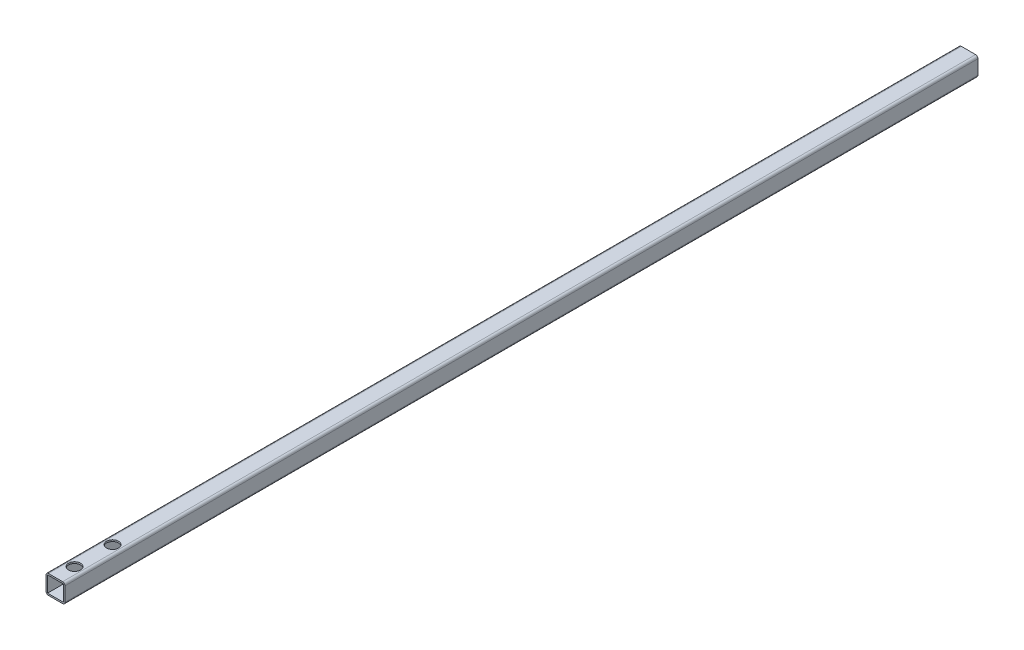
ISO-10303-21;
HEADER;
FILE_DESCRIPTION(('STEP AP214'),'2;1');
FILE_NAME('part.step','',(''),(''),'','','');
FILE_SCHEMA(('AUTOMOTIVE_DESIGN { 1 0 10303 214 1 1 1 1 }'));
ENDSEC;
DATA;
#1=APPLICATION_CONTEXT('core data for automotive mechanical design processes');
#2=APPLICATION_PROTOCOL_DEFINITION('international standard','automotive_design',2000,#1);
#3=PRODUCT_CONTEXT('',#1,'mechanical');
#4=PRODUCT('Part','Part','',(#3));
#5=PRODUCT_RELATED_PRODUCT_CATEGORY('part','',(#4));
#6=PRODUCT_DEFINITION_FORMATION('','',#4);
#7=PRODUCT_DEFINITION_CONTEXT('part definition',#1,'design');
#8=PRODUCT_DEFINITION('design','',#6,#7);
#9=PRODUCT_DEFINITION_SHAPE('','',#8);
#10=(LENGTH_UNIT() NAMED_UNIT(*) SI_UNIT(.MILLI.,.METRE.));
#11=(NAMED_UNIT(*) PLANE_ANGLE_UNIT() SI_UNIT($,.RADIAN.));
#12=(NAMED_UNIT(*) SI_UNIT($,.STERADIAN.) SOLID_ANGLE_UNIT());
#13=UNCERTAINTY_MEASURE_WITH_UNIT(LENGTH_MEASURE(1.E-05),#10,'distance_accuracy_value','');
#14=(GEOMETRIC_REPRESENTATION_CONTEXT(3) GLOBAL_UNCERTAINTY_ASSIGNED_CONTEXT((#13)) GLOBAL_UNIT_ASSIGNED_CONTEXT((#10,
#11,#12)) REPRESENTATION_CONTEXT('',''));
#15=CARTESIAN_POINT('',(0.,0.,0.));
#16=DIRECTION('',(0.,0.,1.));
#17=DIRECTION('',(1.,0.,0.));
#18=AXIS2_PLACEMENT_3D('',#15,#16,#17);
#19=CARTESIAN_POINT('',(-9.525,-9.525,1219.2));
#20=DIRECTION('',(0.,0.,-1.));
#21=DIRECTION('',(-1.,0.,0.));
#22=AXIS2_PLACEMENT_3D('',#19,#20,#21);
#23=PLANE('',#22);
#24=CARTESIAN_POINT('',(-9.525,-9.525,1219.2));
#25=DIRECTION('',(0.,0.,1.));
#26=DIRECTION('',(-1.,0.,0.));
#27=AXIS2_PLACEMENT_3D('',#24,#25,#26);
#28=CIRCLE('',#27,3.175);
#29=CARTESIAN_POINT('',(-12.7,-9.52499999999997,1219.2));
#30=VERTEX_POINT('',#29);
#31=CARTESIAN_POINT('',(-9.52499999999997,-12.7,1219.2));
#32=VERTEX_POINT('',#31);
#33=EDGE_CURVE('E187',#30,#32,#28,.T.);
#34=ORIENTED_EDGE('',*,*,#33,.T.);
#35=DIRECTION('',(1.,0.,0.));
#36=VECTOR('',#35,1.);
#37=CARTESIAN_POINT('',(-9.52499999999997,-12.7,1219.2));
#38=LINE('',#37,#36);
#39=CARTESIAN_POINT('',(9.52499999999998,-12.7,1219.2));
#40=VERTEX_POINT('',#39);
#41=EDGE_CURVE('E191',#32,#40,#38,.T.);
#42=ORIENTED_EDGE('',*,*,#41,.T.);
#43=CARTESIAN_POINT('',(9.525,-9.525,1219.2));
#44=DIRECTION('',(0.,0.,1.));
#45=DIRECTION('',(1.,0.,0.));
#46=AXIS2_PLACEMENT_3D('',#43,#44,#45);
#47=CIRCLE('',#46,3.175);
#48=CARTESIAN_POINT('',(12.7,-9.525,1219.2));
#49=VERTEX_POINT('',#48);
#50=EDGE_CURVE('E195',#40,#49,#47,.T.);
#51=ORIENTED_EDGE('',*,*,#50,.T.);
#52=DIRECTION('',(0.,1.,0.));
#53=VECTOR('',#52,1.);
#54=CARTESIAN_POINT('',(12.7,-9.52499999999997,1219.2));
#55=LINE('',#54,#53);
#56=CARTESIAN_POINT('',(12.7,9.52499999999998,1219.2));
#57=VERTEX_POINT('',#56);
#58=EDGE_CURVE('E198',#49,#57,#55,.T.);
#59=ORIENTED_EDGE('',*,*,#58,.T.);
#60=CARTESIAN_POINT('',(9.525,9.52500000000001,1219.2));
#61=DIRECTION('',(0.,0.,1.));
#62=DIRECTION('',(-1.,0.,0.));
#63=AXIS2_PLACEMENT_3D('',#60,#61,#62);
#64=CIRCLE('',#63,3.175);
#65=CARTESIAN_POINT('',(9.52499999999998,12.7,1219.2));
#66=VERTEX_POINT('',#65);
#67=EDGE_CURVE('E201',#57,#66,#64,.T.);
#68=ORIENTED_EDGE('',*,*,#67,.T.);
#69=DIRECTION('',(-1.,0.,0.));
#70=VECTOR('',#69,1.);
#71=CARTESIAN_POINT('',(-9.52499999999997,12.7,1219.2));
#72=LINE('',#71,#70);
#73=CARTESIAN_POINT('',(-9.52499999999997,12.7,1219.2));
#74=VERTEX_POINT('',#73);
#75=EDGE_CURVE('E204',#66,#74,#72,.T.);
#76=ORIENTED_EDGE('',*,*,#75,.T.);
#77=CARTESIAN_POINT('',(-9.525,9.52500000000001,1219.2));
#78=DIRECTION('',(0.,0.,1.));
#79=DIRECTION('',(-1.,0.,0.));
#80=AXIS2_PLACEMENT_3D('',#77,#78,#79);
#81=CIRCLE('',#80,3.175);
#82=CARTESIAN_POINT('',(-12.7,9.52499999999998,1219.2));
#83=VERTEX_POINT('',#82);
#84=EDGE_CURVE('E207',#74,#83,#81,.T.);
#85=ORIENTED_EDGE('',*,*,#84,.T.);
#86=DIRECTION('',(0.,-1.,0.));
#87=VECTOR('',#86,1.);
#88=CARTESIAN_POINT('',(-12.7,-9.52499999999997,1219.2));
#89=LINE('',#88,#87);
#90=EDGE_CURVE('E210',#83,#30,#89,.T.);
#91=ORIENTED_EDGE('',*,*,#90,.T.);
#92=EDGE_LOOP('',(#34,#42,#51,#59,#68,#76,#85,#91));
#93=FACE_BOUND('',#92,.T.);
#94=DIRECTION('',(0.,1.,0.));
#95=VECTOR('',#94,1.);
#96=CARTESIAN_POINT('',(10.5918,-10.5918,1219.2));
#97=LINE('',#96,#95);
#98=CARTESIAN_POINT('',(10.5918,-10.5918,1219.2));
#99=VERTEX_POINT('',#98);
#100=CARTESIAN_POINT('',(10.5918,10.5918,1219.2));
#101=VERTEX_POINT('',#100);
#102=EDGE_CURVE('E137',#99,#101,#97,.T.);
#103=ORIENTED_EDGE('',*,*,#102,.F.);
#104=DIRECTION('',(1.,0.,0.));
#105=VECTOR('',#104,1.);
#106=CARTESIAN_POINT('',(-10.5918,-10.5918,1219.2));
#107=LINE('',#106,#105);
#108=CARTESIAN_POINT('',(-10.5918,-10.5918,1219.2));
#109=VERTEX_POINT('',#108);
#110=EDGE_CURVE('E163',#109,#99,#107,.T.);
#111=ORIENTED_EDGE('',*,*,#110,.F.);
#112=DIRECTION('',(0.,-1.,0.));
#113=VECTOR('',#112,1.);
#114=CARTESIAN_POINT('',(-10.5918,-10.5918,1219.2));
#115=LINE('',#114,#113);
#116=CARTESIAN_POINT('',(-10.5918,10.5918,1219.2));
#117=VERTEX_POINT('',#116);
#118=EDGE_CURVE('E159',#117,#109,#115,.T.);
#119=ORIENTED_EDGE('',*,*,#118,.F.);
#120=DIRECTION('',(-1.,0.,0.));
#121=VECTOR('',#120,1.);
#122=CARTESIAN_POINT('',(-10.5918,10.5918,1219.2));
#123=LINE('',#122,#121);
#124=EDGE_CURVE('E146',#101,#117,#123,.T.);
#125=ORIENTED_EDGE('',*,*,#124,.F.);
#126=EDGE_LOOP('',(#103,#111,#119,#125));
#127=FACE_BOUND('',#126,.T.);
#128=ADVANCED_FACE('F45',(#93,#127),#23,.F.);
#129=CARTESIAN_POINT('',(-9.525,-9.525,0.));
#130=DIRECTION('',(0.,0.,-1.));
#131=DIRECTION('',(-1.,0.,0.));
#132=AXIS2_PLACEMENT_3D('',#129,#130,#131);
#133=PLANE('',#132);
#134=CARTESIAN_POINT('',(-9.525,-9.525,0.));
#135=DIRECTION('',(0.,0.,1.));
#136=DIRECTION('',(-1.,0.,0.));
#137=AXIS2_PLACEMENT_3D('',#134,#135,#136);
#138=CIRCLE('',#137,3.175);
#139=CARTESIAN_POINT('',(-12.7,-9.52499999999997,0.));
#140=VERTEX_POINT('',#139);
#141=CARTESIAN_POINT('',(-9.52499999999997,-12.7,0.));
#142=VERTEX_POINT('',#141);
#143=EDGE_CURVE('E155',#140,#142,#138,.T.);
#144=ORIENTED_EDGE('',*,*,#143,.F.);
#145=DIRECTION('',(0.,-1.,0.));
#146=VECTOR('',#145,1.);
#147=CARTESIAN_POINT('',(-12.7,-9.52499999999997,0.));
#148=LINE('',#147,#146);
#149=CARTESIAN_POINT('',(-12.7,9.52499999999998,0.));
#150=VERTEX_POINT('',#149);
#151=EDGE_CURVE('E192',#150,#140,#148,.T.);
#152=ORIENTED_EDGE('',*,*,#151,.F.);
#153=CARTESIAN_POINT('',(-9.525,9.52500000000001,0.));
#154=DIRECTION('',(0.,0.,1.));
#155=DIRECTION('',(-1.,0.,0.));
#156=AXIS2_PLACEMENT_3D('',#153,#154,#155);
#157=CIRCLE('',#156,3.175);
#158=CARTESIAN_POINT('',(-9.52499999999997,12.7,0.));
#159=VERTEX_POINT('',#158);
#160=EDGE_CURVE('E232',#159,#150,#157,.T.);
#161=ORIENTED_EDGE('',*,*,#160,.F.);
#162=DIRECTION('',(-1.,0.,0.));
#163=VECTOR('',#162,1.);
#164=CARTESIAN_POINT('',(-9.52499999999997,12.7,0.));
#165=LINE('',#164,#163);
#166=CARTESIAN_POINT('',(9.52499999999998,12.7,0.));
#167=VERTEX_POINT('',#166);
#168=EDGE_CURVE('E229',#167,#159,#165,.T.);
#169=ORIENTED_EDGE('',*,*,#168,.F.);
#170=CARTESIAN_POINT('',(9.525,9.52500000000001,0.));
#171=DIRECTION('',(0.,0.,1.));
#172=DIRECTION('',(-1.,0.,0.));
#173=AXIS2_PLACEMENT_3D('',#170,#171,#172);
#174=CIRCLE('',#173,3.175);
#175=CARTESIAN_POINT('',(12.7,9.52499999999998,0.));
#176=VERTEX_POINT('',#175);
#177=EDGE_CURVE('E226',#176,#167,#174,.T.);
#178=ORIENTED_EDGE('',*,*,#177,.F.);
#179=DIRECTION('',(0.,1.,0.));
#180=VECTOR('',#179,1.);
#181=CARTESIAN_POINT('',(12.7,-9.52499999999997,0.));
#182=LINE('',#181,#180);
#183=CARTESIAN_POINT('',(12.7,-9.525,0.));
#184=VERTEX_POINT('',#183);
#185=EDGE_CURVE('E223',#184,#176,#182,.T.);
#186=ORIENTED_EDGE('',*,*,#185,.F.);
#187=CARTESIAN_POINT('',(9.525,-9.525,0.));
#188=DIRECTION('',(0.,0.,1.));
#189=DIRECTION('',(1.,0.,0.));
#190=AXIS2_PLACEMENT_3D('',#187,#188,#189);
#191=CIRCLE('',#190,3.175);
#192=CARTESIAN_POINT('',(9.52499999999998,-12.7,0.));
#193=VERTEX_POINT('',#192);
#194=EDGE_CURVE('E220',#193,#184,#191,.T.);
#195=ORIENTED_EDGE('',*,*,#194,.F.);
#196=DIRECTION('',(1.,0.,0.));
#197=VECTOR('',#196,1.);
#198=CARTESIAN_POINT('',(-9.52499999999997,-12.7,0.));
#199=LINE('',#198,#197);
#200=EDGE_CURVE('E217',#142,#193,#199,.T.);
#201=ORIENTED_EDGE('',*,*,#200,.F.);
#202=EDGE_LOOP('',(#144,#152,#161,#169,#178,#186,#195,#201));
#203=FACE_BOUND('',#202,.T.);
#204=DIRECTION('',(1.,0.,0.));
#205=VECTOR('',#204,1.);
#206=CARTESIAN_POINT('',(-10.5918,-10.5918,0.));
#207=LINE('',#206,#205);
#208=CARTESIAN_POINT('',(-10.5918,-10.5918,0.));
#209=VERTEX_POINT('',#208);
#210=CARTESIAN_POINT('',(10.5918,-10.5918,0.));
#211=VERTEX_POINT('',#210);
#212=EDGE_CURVE('E147',#209,#211,#207,.T.);
#213=ORIENTED_EDGE('',*,*,#212,.T.);
#214=DIRECTION('',(0.,1.,0.));
#215=VECTOR('',#214,1.);
#216=CARTESIAN_POINT('',(10.5918,-10.5918,0.));
#217=LINE('',#216,#215);
#218=CARTESIAN_POINT('',(10.5918,10.5918,0.));
#219=VERTEX_POINT('',#218);
#220=EDGE_CURVE('E71',#211,#219,#217,.T.);
#221=ORIENTED_EDGE('',*,*,#220,.T.);
#222=DIRECTION('',(-1.,0.,0.));
#223=VECTOR('',#222,1.);
#224=CARTESIAN_POINT('',(-10.5918,10.5918,0.));
#225=LINE('',#224,#223);
#226=CARTESIAN_POINT('',(-10.5918,10.5918,0.));
#227=VERTEX_POINT('',#226);
#228=EDGE_CURVE('E153',#219,#227,#225,.T.);
#229=ORIENTED_EDGE('',*,*,#228,.T.);
#230=DIRECTION('',(0.,-1.,0.));
#231=VECTOR('',#230,1.);
#232=CARTESIAN_POINT('',(-10.5918,-10.5918,0.));
#233=LINE('',#232,#231);
#234=EDGE_CURVE('E174',#227,#209,#233,.T.);
#235=ORIENTED_EDGE('',*,*,#234,.T.);
#236=EDGE_LOOP('',(#213,#221,#229,#235));
#237=FACE_BOUND('',#236,.T.);
#238=ADVANCED_FACE('F314',(#203,#237),#133,.T.);
#239=CARTESIAN_POINT('',(-9.525,-9.525,1219.2));
#240=DIRECTION('',(0.,0.,-1.));
#241=DIRECTION('',(-1.,0.,0.));
#242=AXIS2_PLACEMENT_3D('',#239,#240,#241);
#243=CYLINDRICAL_SURFACE('',#242,3.175);
#244=ORIENTED_EDGE('',*,*,#143,.T.);
#245=DIRECTION('',(0.,0.,-1.));
#246=VECTOR('',#245,1.);
#247=CARTESIAN_POINT('',(-9.52499999999997,-12.7,1219.2));
#248=LINE('',#247,#246);
#249=EDGE_CURVE('E11',#32,#142,#248,.T.);
#250=ORIENTED_EDGE('',*,*,#249,.F.);
#251=ORIENTED_EDGE('',*,*,#33,.F.);
#252=DIRECTION('',(0.,0.,-1.));
#253=VECTOR('',#252,1.);
#254=CARTESIAN_POINT('',(-12.7,-9.52499999999997,1219.2));
#255=LINE('',#254,#253);
#256=EDGE_CURVE('E213',#30,#140,#255,.T.);
#257=ORIENTED_EDGE('',*,*,#256,.T.);
#258=EDGE_LOOP('',(#244,#250,#251,#257));
#259=FACE_BOUND('',#258,.T.);
#260=ADVANCED_FACE('F47',(#259),#243,.T.);
#261=CARTESIAN_POINT('',(-9.52499999999997,-12.7,1219.2));
#262=DIRECTION('',(0.,1.,0.));
#263=DIRECTION('',(0.,0.,1.));
#264=AXIS2_PLACEMENT_3D('',#261,#262,#263);
#265=PLANE('',#264);
#266=CARTESIAN_POINT('',(0.,-12.7000000000002,1193.8));
#267=DIRECTION('',(0.,1.,0.));
#268=DIRECTION('',(0.,0.,1.));
#269=AXIS2_PLACEMENT_3D('',#266,#267,#268);
#270=CIRCLE('',#269,8.00099999999997);
#271=CARTESIAN_POINT('',(0.,-12.7000000000004,1201.801));
#272=VERTEX_POINT('',#271);
#273=EDGE_CURVE('E171',#272,#272,#270,.T.);
#274=ORIENTED_EDGE('',*,*,#273,.T.);
#275=EDGE_LOOP('',(#274));
#276=FACE_BOUND('',#275,.T.);
#277=CARTESIAN_POINT('',(-1.70787202191443E-13,-12.7000000000002,1143.));
#278=DIRECTION('',(0.,1.,0.));
#279=DIRECTION('',(0.,0.,1.));
#280=AXIS2_PLACEMENT_3D('',#277,#278,#279);
#281=CIRCLE('',#280,8.00099999999997);
#282=CARTESIAN_POINT('',(-1.70787202191443E-13,-12.7000000000004,1151.001));
#283=VERTEX_POINT('',#282);
#284=EDGE_CURVE('E272',#283,#283,#281,.T.);
#285=ORIENTED_EDGE('',*,*,#284,.T.);
#286=EDGE_LOOP('',(#285));
#287=FACE_BOUND('',#286,.T.);
#288=ORIENTED_EDGE('',*,*,#200,.T.);
#289=DIRECTION('',(0.,0.,-1.));
#290=VECTOR('',#289,1.);
#291=CARTESIAN_POINT('',(9.52499999999998,-12.7,1219.2));
#292=LINE('',#291,#290);
#293=EDGE_CURVE('E55',#40,#193,#292,.T.);
#294=ORIENTED_EDGE('',*,*,#293,.F.);
#295=ORIENTED_EDGE('',*,*,#41,.F.);
#296=ORIENTED_EDGE('',*,*,#249,.T.);
#297=EDGE_LOOP('',(#288,#294,#295,#296));
#298=FACE_BOUND('',#297,.T.);
#299=ADVANCED_FACE('F293',(#276,#287,#298),#265,.F.);
#300=CARTESIAN_POINT('',(9.525,-9.525,1219.2));
#301=DIRECTION('',(0.,0.,-1.));
#302=DIRECTION('',(-1.,0.,0.));
#303=AXIS2_PLACEMENT_3D('',#300,#301,#302);
#304=CYLINDRICAL_SURFACE('',#303,3.175);
#305=ORIENTED_EDGE('',*,*,#194,.T.);
#306=DIRECTION('',(0.,0.,-1.));
#307=VECTOR('',#306,1.);
#308=CARTESIAN_POINT('',(12.7,-9.525,1219.2));
#309=LINE('',#308,#307);
#310=EDGE_CURVE('E256',#49,#184,#309,.T.);
#311=ORIENTED_EDGE('',*,*,#310,.F.);
#312=ORIENTED_EDGE('',*,*,#50,.F.);
#313=ORIENTED_EDGE('',*,*,#293,.T.);
#314=EDGE_LOOP('',(#305,#311,#312,#313));
#315=FACE_BOUND('',#314,.T.);
#316=ADVANCED_FACE('F344',(#315),#304,.T.);
#317=CARTESIAN_POINT('',(12.7,-9.52499999999997,1219.2));
#318=DIRECTION('',(-1.,0.,0.));
#319=DIRECTION('',(0.,0.,1.));
#320=AXIS2_PLACEMENT_3D('',#317,#318,#319);
#321=PLANE('',#320);
#322=ORIENTED_EDGE('',*,*,#185,.T.);
#323=DIRECTION('',(0.,0.,-1.));
#324=VECTOR('',#323,1.);
#325=CARTESIAN_POINT('',(12.7,9.52499999999998,1219.2));
#326=LINE('',#325,#324);
#327=EDGE_CURVE('E252',#57,#176,#326,.T.);
#328=ORIENTED_EDGE('',*,*,#327,.F.);
#329=ORIENTED_EDGE('',*,*,#58,.F.);
#330=ORIENTED_EDGE('',*,*,#310,.T.);
#331=EDGE_LOOP('',(#322,#328,#329,#330));
#332=FACE_BOUND('',#331,.T.);
#333=ADVANCED_FACE('F340',(#332),#321,.F.);
#334=CARTESIAN_POINT('',(9.525,9.52500000000001,1219.2));
#335=DIRECTION('',(0.,0.,-1.));
#336=DIRECTION('',(-1.,0.,0.));
#337=AXIS2_PLACEMENT_3D('',#334,#335,#336);
#338=CYLINDRICAL_SURFACE('',#337,3.175);
#339=ORIENTED_EDGE('',*,*,#177,.T.);
#340=DIRECTION('',(0.,0.,-1.));
#341=VECTOR('',#340,1.);
#342=CARTESIAN_POINT('',(9.52499999999998,12.7,1219.2));
#343=LINE('',#342,#341);
#344=EDGE_CURVE('E248',#66,#167,#343,.T.);
#345=ORIENTED_EDGE('',*,*,#344,.F.);
#346=ORIENTED_EDGE('',*,*,#67,.F.);
#347=ORIENTED_EDGE('',*,*,#327,.T.);
#348=EDGE_LOOP('',(#339,#345,#346,#347));
#349=FACE_BOUND('',#348,.T.);
#350=ADVANCED_FACE('F336',(#349),#338,.T.);
#351=CARTESIAN_POINT('',(-9.52499999999997,12.7,1219.2));
#352=DIRECTION('',(0.,-1.,0.));
#353=DIRECTION('',(0.,0.,-1.));
#354=AXIS2_PLACEMENT_3D('',#351,#352,#353);
#355=PLANE('',#354);
#356=CARTESIAN_POINT('',(0.,12.7,1193.8));
#357=DIRECTION('',(0.,1.,0.));
#358=DIRECTION('',(0.,0.,1.));
#359=AXIS2_PLACEMENT_3D('',#356,#357,#358);
#360=CIRCLE('',#359,8.00099999999997);
#361=CARTESIAN_POINT('',(0.,12.6999999999999,1201.801));
#362=VERTEX_POINT('',#361);
#363=EDGE_CURVE('E266',#362,#362,#360,.T.);
#364=ORIENTED_EDGE('',*,*,#363,.F.);
#365=EDGE_LOOP('',(#364));
#366=FACE_BOUND('',#365,.T.);
#367=CARTESIAN_POINT('',(-1.70787202191443E-13,12.7,1143.));
#368=DIRECTION('',(0.,1.,0.));
#369=DIRECTION('',(0.,0.,1.));
#370=AXIS2_PLACEMENT_3D('',#367,#368,#369);
#371=CIRCLE('',#370,8.00099999999997);
#372=CARTESIAN_POINT('',(-1.70787202191443E-13,12.6999999999999,1151.001));
#373=VERTEX_POINT('',#372);
#374=EDGE_CURVE('E275',#373,#373,#371,.T.);
#375=ORIENTED_EDGE('',*,*,#374,.F.);
#376=EDGE_LOOP('',(#375));
#377=FACE_BOUND('',#376,.T.);
#378=ORIENTED_EDGE('',*,*,#168,.T.);
#379=DIRECTION('',(0.,0.,-1.));
#380=VECTOR('',#379,1.);
#381=CARTESIAN_POINT('',(-9.52499999999997,12.7,1219.2));
#382=LINE('',#381,#380);
#383=EDGE_CURVE('E244',#74,#159,#382,.T.);
#384=ORIENTED_EDGE('',*,*,#383,.F.);
#385=ORIENTED_EDGE('',*,*,#75,.F.);
#386=ORIENTED_EDGE('',*,*,#344,.T.);
#387=EDGE_LOOP('',(#378,#384,#385,#386));
#388=FACE_BOUND('',#387,.T.);
#389=ADVANCED_FACE('F332',(#366,#377,#388),#355,.F.);
#390=CARTESIAN_POINT('',(-9.525,9.52500000000001,1219.2));
#391=DIRECTION('',(0.,0.,-1.));
#392=DIRECTION('',(-1.,0.,0.));
#393=AXIS2_PLACEMENT_3D('',#390,#391,#392);
#394=CYLINDRICAL_SURFACE('',#393,3.175);
#395=ORIENTED_EDGE('',*,*,#160,.T.);
#396=DIRECTION('',(0.,0.,-1.));
#397=VECTOR('',#396,1.);
#398=CARTESIAN_POINT('',(-12.7,9.52499999999998,1219.2));
#399=LINE('',#398,#397);
#400=EDGE_CURVE('E240',#83,#150,#399,.T.);
#401=ORIENTED_EDGE('',*,*,#400,.F.);
#402=ORIENTED_EDGE('',*,*,#84,.F.);
#403=ORIENTED_EDGE('',*,*,#383,.T.);
#404=EDGE_LOOP('',(#395,#401,#402,#403));
#405=FACE_BOUND('',#404,.T.);
#406=ADVANCED_FACE('F328',(#405),#394,.T.);
#407=CARTESIAN_POINT('',(-12.7,-9.52499999999997,1219.2));
#408=DIRECTION('',(1.,0.,0.));
#409=DIRECTION('',(0.,0.,-1.));
#410=AXIS2_PLACEMENT_3D('',#407,#408,#409);
#411=PLANE('',#410);
#412=ORIENTED_EDGE('',*,*,#151,.T.);
#413=ORIENTED_EDGE('',*,*,#256,.F.);
#414=ORIENTED_EDGE('',*,*,#90,.F.);
#415=ORIENTED_EDGE('',*,*,#400,.T.);
#416=EDGE_LOOP('',(#412,#413,#414,#415));
#417=FACE_BOUND('',#416,.T.);
#418=ADVANCED_FACE('F325',(#417),#411,.F.);
#419=CARTESIAN_POINT('',(10.5918,-10.5918,1219.2));
#420=DIRECTION('',(-1.,0.,0.));
#421=DIRECTION('',(0.,0.,1.));
#422=AXIS2_PLACEMENT_3D('',#419,#420,#421);
#423=PLANE('',#422);
#424=ORIENTED_EDGE('',*,*,#220,.F.);
#425=DIRECTION('',(0.,0.,-1.));
#426=VECTOR('',#425,1.);
#427=CARTESIAN_POINT('',(10.5918,-10.5918,1219.2));
#428=LINE('',#427,#426);
#429=EDGE_CURVE('E141',#99,#211,#428,.T.);
#430=ORIENTED_EDGE('',*,*,#429,.F.);
#431=ORIENTED_EDGE('',*,*,#102,.T.);
#432=DIRECTION('',(0.,0.,-1.));
#433=VECTOR('',#432,1.);
#434=CARTESIAN_POINT('',(10.5918,10.5918,1219.2));
#435=LINE('',#434,#433);
#436=EDGE_CURVE('E140',#101,#219,#435,.T.);
#437=ORIENTED_EDGE('',*,*,#436,.T.);
#438=EDGE_LOOP('',(#424,#430,#431,#437));
#439=FACE_BOUND('',#438,.T.);
#440=ADVANCED_FACE('F139',(#439),#423,.T.);
#441=CARTESIAN_POINT('',(-10.5918,10.5918,1219.2));
#442=DIRECTION('',(0.,-1.,0.));
#443=DIRECTION('',(0.,0.,-1.));
#444=AXIS2_PLACEMENT_3D('',#441,#442,#443);
#445=PLANE('',#444);
#446=CARTESIAN_POINT('',(0.,10.5917999999998,1193.8));
#447=DIRECTION('',(0.,-1.,0.));
#448=DIRECTION('',(0.,0.,-1.));
#449=AXIS2_PLACEMENT_3D('',#446,#447,#448);
#450=CIRCLE('',#449,8.00099999999997);
#451=CARTESIAN_POINT('',(0.,10.5918,1201.801));
#452=VERTEX_POINT('',#451);
#453=EDGE_CURVE('E286',#452,#452,#450,.T.);
#454=ORIENTED_EDGE('',*,*,#453,.F.);
#455=EDGE_LOOP('',(#454));
#456=FACE_BOUND('',#455,.T.);
#457=CARTESIAN_POINT('',(-1.70787202191443E-13,10.5917999999998,1143.));
#458=DIRECTION('',(0.,-1.,0.));
#459=DIRECTION('',(0.,0.,-1.));
#460=AXIS2_PLACEMENT_3D('',#457,#458,#459);
#461=CIRCLE('',#460,8.00099999999997);
#462=CARTESIAN_POINT('',(-1.70787202191443E-13,10.5918,1151.001));
#463=VERTEX_POINT('',#462);
#464=EDGE_CURVE('E265',#463,#463,#461,.T.);
#465=ORIENTED_EDGE('',*,*,#464,.F.);
#466=EDGE_LOOP('',(#465));
#467=FACE_BOUND('',#466,.T.);
#468=ORIENTED_EDGE('',*,*,#228,.F.);
#469=ORIENTED_EDGE('',*,*,#436,.F.);
#470=ORIENTED_EDGE('',*,*,#124,.T.);
#471=DIRECTION('',(0.,0.,-1.));
#472=VECTOR('',#471,1.);
#473=CARTESIAN_POINT('',(-10.5918,10.5918,1219.2));
#474=LINE('',#473,#472);
#475=EDGE_CURVE('E156',#117,#227,#474,.T.);
#476=ORIENTED_EDGE('',*,*,#475,.T.);
#477=EDGE_LOOP('',(#468,#469,#470,#476));
#478=FACE_BOUND('',#477,.T.);
#479=ADVANCED_FACE('F150',(#456,#467,#478),#445,.T.);
#480=CARTESIAN_POINT('',(-10.5918,-10.5918,1219.2));
#481=DIRECTION('',(1.,0.,0.));
#482=DIRECTION('',(0.,0.,-1.));
#483=AXIS2_PLACEMENT_3D('',#480,#481,#482);
#484=PLANE('',#483);
#485=ORIENTED_EDGE('',*,*,#234,.F.);
#486=ORIENTED_EDGE('',*,*,#475,.F.);
#487=ORIENTED_EDGE('',*,*,#118,.T.);
#488=DIRECTION('',(0.,0.,-1.));
#489=VECTOR('',#488,1.);
#490=CARTESIAN_POINT('',(-10.5918,-10.5918,1219.2));
#491=LINE('',#490,#489);
#492=EDGE_CURVE('E63',#109,#209,#491,.T.);
#493=ORIENTED_EDGE('',*,*,#492,.T.);
#494=EDGE_LOOP('',(#485,#486,#487,#493));
#495=FACE_BOUND('',#494,.T.);
#496=ADVANCED_FACE('F383',(#495),#484,.T.);
#497=CARTESIAN_POINT('',(-10.5918,-10.5918,1219.2));
#498=DIRECTION('',(0.,1.,0.));
#499=DIRECTION('',(0.,0.,1.));
#500=AXIS2_PLACEMENT_3D('',#497,#498,#499);
#501=PLANE('',#500);
#502=CARTESIAN_POINT('',(0.,-10.5918000000003,1193.8));
#503=DIRECTION('',(0.,1.,0.));
#504=DIRECTION('',(0.,0.,1.));
#505=AXIS2_PLACEMENT_3D('',#502,#503,#504);
#506=CIRCLE('',#505,8.00099999999997);
#507=CARTESIAN_POINT('',(0.,-10.5918000000005,1201.801));
#508=VERTEX_POINT('',#507);
#509=EDGE_CURVE('E49',#508,#508,#506,.T.);
#510=ORIENTED_EDGE('',*,*,#509,.F.);
#511=EDGE_LOOP('',(#510));
#512=FACE_BOUND('',#511,.T.);
#513=CARTESIAN_POINT('',(-1.70787202191443E-13,-10.5918000000003,1143.));
#514=DIRECTION('',(0.,1.,0.));
#515=DIRECTION('',(0.,0.,1.));
#516=AXIS2_PLACEMENT_3D('',#513,#514,#515);
#517=CIRCLE('',#516,8.00099999999997);
#518=CARTESIAN_POINT('',(-1.70787202191443E-13,-10.5918000000005,1151.001));
#519=VERTEX_POINT('',#518);
#520=EDGE_CURVE('E262',#519,#519,#517,.T.);
#521=ORIENTED_EDGE('',*,*,#520,.F.);
#522=EDGE_LOOP('',(#521));
#523=FACE_BOUND('',#522,.T.);
#524=ORIENTED_EDGE('',*,*,#212,.F.);
#525=ORIENTED_EDGE('',*,*,#492,.F.);
#526=ORIENTED_EDGE('',*,*,#110,.T.);
#527=ORIENTED_EDGE('',*,*,#429,.T.);
#528=EDGE_LOOP('',(#524,#525,#526,#527));
#529=FACE_BOUND('',#528,.T.);
#530=ADVANCED_FACE('F309',(#512,#523,#529),#501,.T.);
#531=CARTESIAN_POINT('',(-1.70787202191443E-13,-1206.5,1143.));
#532=DIRECTION('',(0.,1.,0.));
#533=DIRECTION('',(0.,0.,1.));
#534=AXIS2_PLACEMENT_3D('',#531,#532,#533);
#535=CYLINDRICAL_SURFACE('',#534,8.00099999999997);
#536=CARTESIAN_POINT('',(-1.70787202191443E-13,-10.5918000000005,1151.001));
#537=CARTESIAN_POINT('',(-1.70787202191443E-13,-10.6137604166672,1151.001));
#538=CARTESIAN_POINT('',(-1.70787202191443E-13,-10.6357208333339,1151.001));
#539=CARTESIAN_POINT('',(-1.70787202191443E-13,-10.6796416666672,1151.001));
#540=CARTESIAN_POINT('',(-1.70787202191443E-13,-10.7016020833338,1151.001));
#541=CARTESIAN_POINT('',(-1.70787202191443E-13,-10.7455229166671,1151.001));
#542=CARTESIAN_POINT('',(-1.70787202191443E-13,-10.7674833333338,1151.001));
#543=CARTESIAN_POINT('',(-1.70787202191443E-13,-10.8114041666671,1151.001));
#544=CARTESIAN_POINT('',(-1.70787202191443E-13,-10.8333645833338,1151.001));
#545=CARTESIAN_POINT('',(-1.70787202191443E-13,-10.8772854166671,1151.001));
#546=CARTESIAN_POINT('',(-1.70787202191443E-13,-10.8992458333338,1151.001));
#547=CARTESIAN_POINT('',(-1.70787202191443E-13,-10.9431666666671,1151.001));
#548=CARTESIAN_POINT('',(-1.70787202191443E-13,-10.9651270833337,1151.001));
#549=CARTESIAN_POINT('',(-1.70787202191443E-13,-11.0090479166671,1151.001));
#550=CARTESIAN_POINT('',(-1.70787202191443E-13,-11.0310083333338,1151.001));
#551=CARTESIAN_POINT('',(-1.70787202191443E-13,-11.0749291666672,1151.001));
#552=CARTESIAN_POINT('',(-1.70787202191443E-13,-11.0968895833339,1151.001));
#553=CARTESIAN_POINT('',(-1.70787202191443E-13,-11.1408104166672,1151.001));
#554=CARTESIAN_POINT('',(-1.70787202191443E-13,-11.1627708333338,1151.001));
#555=CARTESIAN_POINT('',(-1.70787202191443E-13,-11.2066916666671,1151.001));
#556=CARTESIAN_POINT('',(-1.70787202191443E-13,-11.2286520833338,1151.001));
#557=CARTESIAN_POINT('',(-1.70787202191443E-13,-11.2725729166672,1151.001));
#558=CARTESIAN_POINT('',(-1.70787202191443E-13,-11.2945333333339,1151.001));
#559=CARTESIAN_POINT('',(-1.70787202191443E-13,-11.3384541666672,1151.001));
#560=CARTESIAN_POINT('',(-1.70787202191443E-13,-11.3604145833338,1151.001));
#561=CARTESIAN_POINT('',(-1.70787202191443E-13,-11.4043354166671,1151.001));
#562=CARTESIAN_POINT('',(-1.70787202191443E-13,-11.4262958333338,1151.001));
#563=CARTESIAN_POINT('',(-1.70787202191443E-13,-11.4702166666671,1151.001));
#564=CARTESIAN_POINT('',(-1.70787202191443E-13,-11.4921770833338,1151.001));
#565=CARTESIAN_POINT('',(-1.70787202191443E-13,-11.5360979166671,1151.001));
#566=CARTESIAN_POINT('',(-1.70787202191443E-13,-11.5580583333338,1151.001));
#567=CARTESIAN_POINT('',(-1.70787202191443E-13,-11.6019791666671,1151.001));
#568=CARTESIAN_POINT('',(-1.70787202191443E-13,-11.6239395833337,1151.001));
#569=CARTESIAN_POINT('',(-1.70787202191443E-13,-11.6678604166671,1151.001));
#570=CARTESIAN_POINT('',(-1.70787202191443E-13,-11.6898208333338,1151.001));
#571=CARTESIAN_POINT('',(-1.70787202191443E-13,-11.7337416666671,1151.001));
#572=CARTESIAN_POINT('',(-1.70787202191443E-13,-11.7557020833337,1151.001));
#573=CARTESIAN_POINT('',(-1.70787202191443E-13,-11.799622916667,1151.001));
#574=CARTESIAN_POINT('',(-1.70787202191443E-13,-11.8215833333337,1151.001));
#575=CARTESIAN_POINT('',(-1.70787202191443E-13,-11.8655041666671,1151.001));
#576=CARTESIAN_POINT('',(-1.70787202191443E-13,-11.8874645833338,1151.001));
#577=CARTESIAN_POINT('',(-1.70787202191443E-13,-11.9313854166671,1151.001));
#578=CARTESIAN_POINT('',(-1.70787202191443E-13,-11.9533458333337,1151.001));
#579=CARTESIAN_POINT('',(-1.70787202191443E-13,-11.997266666667,1151.001));
#580=CARTESIAN_POINT('',(-1.70787202191443E-13,-12.0192270833337,1151.001));
#581=CARTESIAN_POINT('',(-1.70787202191443E-13,-12.0631479166671,1151.001));
#582=CARTESIAN_POINT('',(-1.70787202191443E-13,-12.0851083333338,1151.001));
#583=CARTESIAN_POINT('',(-1.70787202191443E-13,-12.1290291666671,1151.001));
#584=CARTESIAN_POINT('',(-1.70787202191443E-13,-12.1509895833337,1151.001));
#585=CARTESIAN_POINT('',(-1.70787202191443E-13,-12.194910416667,1151.001));
#586=CARTESIAN_POINT('',(-1.70787202191443E-13,-12.2168708333337,1151.001));
#587=CARTESIAN_POINT('',(-1.70787202191443E-13,-12.260791666667,1151.001));
#588=CARTESIAN_POINT('',(-1.70787202191443E-13,-12.2827520833337,1151.001));
#589=CARTESIAN_POINT('',(-1.70787202191443E-13,-12.3266729166671,1151.001));
#590=CARTESIAN_POINT('',(-1.70787202191443E-13,-12.3486333333338,1151.001));
#591=CARTESIAN_POINT('',(-1.70787202191443E-13,-12.3925541666671,1151.001));
#592=CARTESIAN_POINT('',(-1.70787202191443E-13,-12.4145145833337,1151.001));
#593=CARTESIAN_POINT('',(-1.70787202191443E-13,-12.458435416667,1151.001));
#594=CARTESIAN_POINT('',(-1.70787202191443E-13,-12.4803958333337,1151.001));
#595=CARTESIAN_POINT('',(-1.70787202191443E-13,-12.5243166666671,1151.001));
#596=CARTESIAN_POINT('',(-1.70787202191443E-13,-12.5462770833338,1151.001));
#597=CARTESIAN_POINT('',(-1.70787202191443E-13,-12.5901979166671,1151.001));
#598=CARTESIAN_POINT('',(-1.70787202191443E-13,-12.6121583333337,1151.001));
#599=CARTESIAN_POINT('',(-1.70787202191443E-13,-12.656079166667,1151.001));
#600=CARTESIAN_POINT('',(-1.70787202191443E-13,-12.6780395833337,1151.001));
#601=CARTESIAN_POINT('',(-1.70787202191443E-13,-12.7000000000004,1151.001));
#602=B_SPLINE_CURVE_WITH_KNOTS('',3,(#536,#537,#538,#539,#540,#541,#542,#543,#544,#545,#546,
#547,#548,#549,#550,#551,#552,#553,#554,#555,#556,#557,#558,#559,#560,#561,#562,#563,#564,#565,
#566,#567,#568,#569,#570,#571,#572,#573,#574,#575,#576,#577,#578,#579,#580,#581,#582,#583,#584,
#585,#586,#587,#588,#589,#590,#591,#592,#593,#594,#595,#596,#597,#598,#599,#600,#601),
.UNSPECIFIED.,.F.,.F.,(4,2,2,2,2,2,2,2,2,2,2,2,2,2,2,2,2,2,2,2,2,2,2,2,2,2,2,2,2,2,2,2,4),(0.,
0.0658812500000661,0.13176249999991,0.197643749999976,0.263525000000042,0.329406249999886,
0.395287499999952,0.461168750000018,0.527050000000084,0.592931249999928,0.658812499999994,
0.724693750000061,0.790574999999905,0.856456249999971,0.922337500000037,0.988218749999881,
1.05409999999995,1.11998125000001,1.18586249999986,1.25174374999992,1.31762499999999,
1.38350624999983,1.4493874999999,1.51526874999997,1.58114999999981,1.64703124999988,
1.71291249999994,1.77879375000001,1.84467499999985,1.91055624999992,1.97643749999998,
2.04231874999983,2.10819999999989),.UNSPECIFIED.);
#603=EDGE_CURVE('BSEAM299',#519,#283,#602,.T.);
#604=ORIENTED_EDGE('',*,*,#520,.T.);
#605=ORIENTED_EDGE('',*,*,#284,.F.);
#606=ORIENTED_EDGE('',*,*,#603,.T.);
#607=ORIENTED_EDGE('',*,*,#603,.F.);
#608=EDGE_LOOP('',(#604,#606,#605,#607));
#609=FACE_BOUND('',#608,.T.);
#610=ADVANCED_FACE('F299',(#609),#535,.F.);
#611=CARTESIAN_POINT('',(0.,-1206.5,1193.8));
#612=DIRECTION('',(0.,1.,0.));
#613=DIRECTION('',(0.,0.,1.));
#614=AXIS2_PLACEMENT_3D('',#611,#612,#613);
#615=CYLINDRICAL_SURFACE('',#614,8.00099999999997);
#616=CARTESIAN_POINT('',(0.,-10.5918000000005,1201.801));
#617=CARTESIAN_POINT('',(0.,-10.6137604166672,1201.801));
#618=CARTESIAN_POINT('',(0.,-10.6357208333339,1201.801));
#619=CARTESIAN_POINT('',(0.,-10.6796416666672,1201.801));
#620=CARTESIAN_POINT('',(0.,-10.7016020833338,1201.801));
#621=CARTESIAN_POINT('',(0.,-10.7455229166671,1201.801));
#622=CARTESIAN_POINT('',(0.,-10.7674833333338,1201.801));
#623=CARTESIAN_POINT('',(0.,-10.8114041666671,1201.801));
#624=CARTESIAN_POINT('',(0.,-10.8333645833338,1201.801));
#625=CARTESIAN_POINT('',(0.,-10.8772854166671,1201.801));
#626=CARTESIAN_POINT('',(0.,-10.8992458333338,1201.801));
#627=CARTESIAN_POINT('',(0.,-10.9431666666671,1201.801));
#628=CARTESIAN_POINT('',(0.,-10.9651270833337,1201.801));
#629=CARTESIAN_POINT('',(0.,-11.0090479166671,1201.801));
#630=CARTESIAN_POINT('',(0.,-11.0310083333338,1201.801));
#631=CARTESIAN_POINT('',(0.,-11.0749291666672,1201.801));
#632=CARTESIAN_POINT('',(0.,-11.0968895833339,1201.801));
#633=CARTESIAN_POINT('',(0.,-11.1408104166672,1201.801));
#634=CARTESIAN_POINT('',(0.,-11.1627708333338,1201.801));
#635=CARTESIAN_POINT('',(0.,-11.2066916666671,1201.801));
#636=CARTESIAN_POINT('',(0.,-11.2286520833338,1201.801));
#637=CARTESIAN_POINT('',(0.,-11.2725729166672,1201.801));
#638=CARTESIAN_POINT('',(0.,-11.2945333333339,1201.801));
#639=CARTESIAN_POINT('',(0.,-11.3384541666672,1201.801));
#640=CARTESIAN_POINT('',(0.,-11.3604145833338,1201.801));
#641=CARTESIAN_POINT('',(0.,-11.4043354166671,1201.801));
#642=CARTESIAN_POINT('',(0.,-11.4262958333338,1201.801));
#643=CARTESIAN_POINT('',(0.,-11.4702166666671,1201.801));
#644=CARTESIAN_POINT('',(0.,-11.4921770833338,1201.801));
#645=CARTESIAN_POINT('',(0.,-11.5360979166671,1201.801));
#646=CARTESIAN_POINT('',(0.,-11.5580583333338,1201.801));
#647=CARTESIAN_POINT('',(0.,-11.6019791666671,1201.801));
#648=CARTESIAN_POINT('',(0.,-11.6239395833337,1201.801));
#649=CARTESIAN_POINT('',(0.,-11.6678604166671,1201.801));
#650=CARTESIAN_POINT('',(0.,-11.6898208333338,1201.801));
#651=CARTESIAN_POINT('',(0.,-11.7337416666671,1201.801));
#652=CARTESIAN_POINT('',(0.,-11.7557020833337,1201.801));
#653=CARTESIAN_POINT('',(0.,-11.799622916667,1201.801));
#654=CARTESIAN_POINT('',(0.,-11.8215833333337,1201.801));
#655=CARTESIAN_POINT('',(0.,-11.8655041666671,1201.801));
#656=CARTESIAN_POINT('',(0.,-11.8874645833338,1201.801));
#657=CARTESIAN_POINT('',(0.,-11.9313854166671,1201.801));
#658=CARTESIAN_POINT('',(0.,-11.9533458333337,1201.801));
#659=CARTESIAN_POINT('',(0.,-11.997266666667,1201.801));
#660=CARTESIAN_POINT('',(0.,-12.0192270833337,1201.801));
#661=CARTESIAN_POINT('',(0.,-12.0631479166671,1201.801));
#662=CARTESIAN_POINT('',(0.,-12.0851083333338,1201.801));
#663=CARTESIAN_POINT('',(0.,-12.1290291666671,1201.801));
#664=CARTESIAN_POINT('',(0.,-12.1509895833337,1201.801));
#665=CARTESIAN_POINT('',(0.,-12.194910416667,1201.801));
#666=CARTESIAN_POINT('',(0.,-12.2168708333337,1201.801));
#667=CARTESIAN_POINT('',(0.,-12.260791666667,1201.801));
#668=CARTESIAN_POINT('',(0.,-12.2827520833337,1201.801));
#669=CARTESIAN_POINT('',(0.,-12.3266729166671,1201.801));
#670=CARTESIAN_POINT('',(0.,-12.3486333333338,1201.801));
#671=CARTESIAN_POINT('',(0.,-12.3925541666671,1201.801));
#672=CARTESIAN_POINT('',(0.,-12.4145145833337,1201.801));
#673=CARTESIAN_POINT('',(0.,-12.458435416667,1201.801));
#674=CARTESIAN_POINT('',(0.,-12.4803958333337,1201.801));
#675=CARTESIAN_POINT('',(0.,-12.5243166666671,1201.801));
#676=CARTESIAN_POINT('',(0.,-12.5462770833338,1201.801));
#677=CARTESIAN_POINT('',(0.,-12.5901979166671,1201.801));
#678=CARTESIAN_POINT('',(0.,-12.6121583333337,1201.801));
#679=CARTESIAN_POINT('',(0.,-12.656079166667,1201.801));
#680=CARTESIAN_POINT('',(0.,-12.6780395833337,1201.801));
#681=CARTESIAN_POINT('',(0.,-12.7000000000004,1201.801));
#682=B_SPLINE_CURVE_WITH_KNOTS('',3,(#616,#617,#618,#619,#620,#621,#622,#623,#624,#625,#626,
#627,#628,#629,#630,#631,#632,#633,#634,#635,#636,#637,#638,#639,#640,#641,#642,#643,#644,#645,
#646,#647,#648,#649,#650,#651,#652,#653,#654,#655,#656,#657,#658,#659,#660,#661,#662,#663,#664,
#665,#666,#667,#668,#669,#670,#671,#672,#673,#674,#675,#676,#677,#678,#679,#680,#681),
.UNSPECIFIED.,.F.,.F.,(4,2,2,2,2,2,2,2,2,2,2,2,2,2,2,2,2,2,2,2,2,2,2,2,2,2,2,2,2,2,2,2,4),(0.,
0.0658812500000661,0.13176249999991,0.197643749999976,0.263525000000042,0.329406249999886,
0.395287499999952,0.461168750000018,0.527050000000084,0.592931249999928,0.658812499999994,
0.724693750000061,0.790574999999905,0.856456249999971,0.922337500000037,0.988218749999881,
1.05409999999995,1.11998125000001,1.18586249999986,1.25174374999992,1.31762499999999,
1.38350624999983,1.4493874999999,1.51526874999997,1.58114999999981,1.64703124999988,
1.71291249999994,1.77879375000001,1.84467499999985,1.91055624999992,1.97643749999998,
2.04231874999983,2.10819999999989),.UNSPECIFIED.);
#683=EDGE_CURVE('BSEAM296',#508,#272,#682,.T.);
#684=ORIENTED_EDGE('',*,*,#509,.T.);
#685=ORIENTED_EDGE('',*,*,#273,.F.);
#686=ORIENTED_EDGE('',*,*,#683,.T.);
#687=ORIENTED_EDGE('',*,*,#683,.F.);
#688=EDGE_LOOP('',(#684,#686,#685,#687));
#689=FACE_BOUND('',#688,.T.);
#690=ADVANCED_FACE('F296',(#689),#615,.F.);
#691=CARTESIAN_POINT('',(-1.70787202191443E-13,10.5918,1151.001));
#692=CARTESIAN_POINT('',(-1.70787202191443E-13,10.6137604166667,1151.001));
#693=CARTESIAN_POINT('',(-1.70787202191443E-13,10.6357208333334,1151.001));
#694=CARTESIAN_POINT('',(-1.70787202191443E-13,10.6796416666667,1151.001));
#695=CARTESIAN_POINT('',(-1.70787202191443E-13,10.7016020833333,1151.001));
#696=CARTESIAN_POINT('',(-1.70787202191443E-13,10.7455229166666,1151.001));
#697=CARTESIAN_POINT('',(-1.70787202191443E-13,10.7674833333333,1151.001));
#698=CARTESIAN_POINT('',(-1.70787202191443E-13,10.8114041666667,1151.001));
#699=CARTESIAN_POINT('',(-1.70787202191443E-13,10.8333645833334,1151.001));
#700=CARTESIAN_POINT('',(-1.70787202191443E-13,10.8772854166667,1151.001));
#701=CARTESIAN_POINT('',(-1.70787202191443E-13,10.8992458333333,1151.001));
#702=CARTESIAN_POINT('',(-1.70787202191443E-13,10.9431666666666,1151.001));
#703=CARTESIAN_POINT('',(-1.70787202191443E-13,10.9651270833333,1151.001));
#704=CARTESIAN_POINT('',(-1.70787202191443E-13,11.0090479166667,1151.001));
#705=CARTESIAN_POINT('',(-1.70787202191443E-13,11.0310083333334,1151.001));
#706=CARTESIAN_POINT('',(-1.70787202191443E-13,11.0749291666667,1151.001));
#707=CARTESIAN_POINT('',(-1.70787202191443E-13,11.0968895833334,1151.001));
#708=CARTESIAN_POINT('',(-1.70787202191443E-13,11.1408104166667,1151.001));
#709=CARTESIAN_POINT('',(-1.70787202191443E-13,11.1627708333334,1151.001));
#710=CARTESIAN_POINT('',(-1.70787202191443E-13,11.2066916666667,1151.001));
#711=CARTESIAN_POINT('',(-1.70787202191443E-13,11.2286520833333,1151.001));
#712=CARTESIAN_POINT('',(-1.70787202191443E-13,11.2725729166667,1151.001));
#713=CARTESIAN_POINT('',(-1.70787202191443E-13,11.2945333333334,1151.001));
#714=CARTESIAN_POINT('',(-1.70787202191443E-13,11.3384541666667,1151.001));
#715=CARTESIAN_POINT('',(-1.70787202191443E-13,11.3604145833333,1151.001));
#716=CARTESIAN_POINT('',(-1.70787202191443E-13,11.4043354166666,1151.001));
#717=CARTESIAN_POINT('',(-1.70787202191443E-13,11.4262958333333,1151.001));
#718=CARTESIAN_POINT('',(-1.70787202191443E-13,11.4702166666667,1151.001));
#719=CARTESIAN_POINT('',(-1.70787202191443E-13,11.4921770833334,1151.001));
#720=CARTESIAN_POINT('',(-1.70787202191443E-13,11.5360979166667,1151.001));
#721=CARTESIAN_POINT('',(-1.70787202191443E-13,11.5580583333333,1151.001));
#722=CARTESIAN_POINT('',(-1.70787202191443E-13,11.6019791666666,1151.001));
#723=CARTESIAN_POINT('',(-1.70787202191443E-13,11.6239395833333,1151.001));
#724=CARTESIAN_POINT('',(-1.70787202191443E-13,11.6678604166667,1151.001));
#725=CARTESIAN_POINT('',(-1.70787202191443E-13,11.6898208333334,1151.001));
#726=CARTESIAN_POINT('',(-1.70787202191443E-13,11.7337416666667,1151.001));
#727=CARTESIAN_POINT('',(-1.70787202191443E-13,11.7557020833333,1151.001));
#728=CARTESIAN_POINT('',(-1.70787202191443E-13,11.7996229166666,1151.001));
#729=CARTESIAN_POINT('',(-1.70787202191443E-13,11.8215833333333,1151.001));
#730=CARTESIAN_POINT('',(-1.70787202191443E-13,11.8655041666667,1151.001));
#731=CARTESIAN_POINT('',(-1.70787202191443E-13,11.8874645833333,1151.001));
#732=CARTESIAN_POINT('',(-1.70787202191443E-13,11.9313854166666,1151.001));
#733=CARTESIAN_POINT('',(-1.70787202191443E-13,11.9533458333333,1151.001));
#734=CARTESIAN_POINT('',(-1.70787202191443E-13,11.9972666666666,1151.001));
#735=CARTESIAN_POINT('',(-1.70787202191443E-13,12.0192270833333,1151.001));
#736=CARTESIAN_POINT('',(-1.70787202191443E-13,12.0631479166666,1151.001));
#737=CARTESIAN_POINT('',(-1.70787202191443E-13,12.0851083333333,1151.001));
#738=CARTESIAN_POINT('',(-1.70787202191443E-13,12.1290291666666,1151.001));
#739=CARTESIAN_POINT('',(-1.70787202191443E-13,12.1509895833332,1151.001));
#740=CARTESIAN_POINT('',(-1.70787202191443E-13,12.1949104166665,1151.001));
#741=CARTESIAN_POINT('',(-1.70787202191443E-13,12.2168708333332,1151.001));
#742=CARTESIAN_POINT('',(-1.70787202191443E-13,12.2607916666666,1151.001));
#743=CARTESIAN_POINT('',(-1.70787202191443E-13,12.2827520833333,1151.001));
#744=CARTESIAN_POINT('',(-1.70787202191443E-13,12.3266729166667,1151.001));
#745=CARTESIAN_POINT('',(-1.70787202191443E-13,12.3486333333334,1151.001));
#746=CARTESIAN_POINT('',(-1.70787202191443E-13,12.3925541666667,1151.001));
#747=CARTESIAN_POINT('',(-1.70787202191443E-13,12.4145145833333,1151.001));
#748=CARTESIAN_POINT('',(-1.70787202191443E-13,12.4584354166666,1151.001));
#749=CARTESIAN_POINT('',(-1.70787202191443E-13,12.4803958333333,1151.001));
#750=CARTESIAN_POINT('',(-1.70787202191443E-13,12.5243166666666,1151.001));
#751=CARTESIAN_POINT('',(-1.70787202191443E-13,12.5462770833333,1151.001));
#752=CARTESIAN_POINT('',(-1.70787202191443E-13,12.5901979166666,1151.001));
#753=CARTESIAN_POINT('',(-1.70787202191443E-13,12.6121583333333,1151.001));
#754=CARTESIAN_POINT('',(-1.70787202191443E-13,12.6560791666666,1151.001));
#755=CARTESIAN_POINT('',(-1.70787202191443E-13,12.6780395833332,1151.001));
#756=CARTESIAN_POINT('',(-1.70787202191443E-13,12.6999999999999,1151.001));
#757=B_SPLINE_CURVE_WITH_KNOTS('',3,(#691,#692,#693,#694,#695,#696,#697,#698,#699,#700,#701,
#702,#703,#704,#705,#706,#707,#708,#709,#710,#711,#712,#713,#714,#715,#716,#717,#718,#719,#720,
#721,#722,#723,#724,#725,#726,#727,#728,#729,#730,#731,#732,#733,#734,#735,#736,#737,#738,#739,
#740,#741,#742,#743,#744,#745,#746,#747,#748,#749,#750,#751,#752,#753,#754,#755,#756),
.UNSPECIFIED.,.F.,.F.,(4,2,2,2,2,2,2,2,2,2,2,2,2,2,2,2,2,2,2,2,2,2,2,2,2,2,2,2,2,2,2,2,4),(0.,
0.0658812500000661,0.13176249999991,0.197643749999976,0.263525000000042,0.329406249999886,
0.395287499999952,0.461168750000018,0.527050000000084,0.592931249999928,0.658812499999994,
0.724693750000061,0.790574999999905,0.856456249999971,0.922337500000037,0.988218749999881,
1.05409999999995,1.11998125000001,1.18586249999986,1.25174374999992,1.31762499999999,
1.38350624999983,1.4493874999999,1.51526874999997,1.58114999999981,1.64703124999988,
1.71291249999994,1.77879375000001,1.84467499999985,1.91055624999992,1.97643749999998,
2.04231874999983,2.10819999999989),.UNSPECIFIED.);
#758=EDGE_CURVE('BSEAM298',#463,#373,#757,.T.);
#759=ORIENTED_EDGE('',*,*,#464,.T.);
#760=ORIENTED_EDGE('',*,*,#374,.T.);
#761=ORIENTED_EDGE('',*,*,#758,.T.);
#762=ORIENTED_EDGE('',*,*,#758,.F.);
#763=EDGE_LOOP('',(#759,#761,#760,#762));
#764=FACE_BOUND('',#763,.T.);
#765=ADVANCED_FACE('F298',(#764),#535,.F.);
#766=CARTESIAN_POINT('',(0.,10.5918,1201.801));
#767=CARTESIAN_POINT('',(0.,10.6137604166667,1201.801));
#768=CARTESIAN_POINT('',(0.,10.6357208333334,1201.801));
#769=CARTESIAN_POINT('',(0.,10.6796416666667,1201.801));
#770=CARTESIAN_POINT('',(0.,10.7016020833333,1201.801));
#771=CARTESIAN_POINT('',(0.,10.7455229166666,1201.801));
#772=CARTESIAN_POINT('',(0.,10.7674833333333,1201.801));
#773=CARTESIAN_POINT('',(0.,10.8114041666667,1201.801));
#774=CARTESIAN_POINT('',(0.,10.8333645833334,1201.801));
#775=CARTESIAN_POINT('',(0.,10.8772854166667,1201.801));
#776=CARTESIAN_POINT('',(0.,10.8992458333333,1201.801));
#777=CARTESIAN_POINT('',(0.,10.9431666666666,1201.801));
#778=CARTESIAN_POINT('',(0.,10.9651270833333,1201.801));
#779=CARTESIAN_POINT('',(0.,11.0090479166667,1201.801));
#780=CARTESIAN_POINT('',(0.,11.0310083333334,1201.801));
#781=CARTESIAN_POINT('',(0.,11.0749291666667,1201.801));
#782=CARTESIAN_POINT('',(0.,11.0968895833334,1201.801));
#783=CARTESIAN_POINT('',(0.,11.1408104166667,1201.801));
#784=CARTESIAN_POINT('',(0.,11.1627708333334,1201.801));
#785=CARTESIAN_POINT('',(0.,11.2066916666667,1201.801));
#786=CARTESIAN_POINT('',(0.,11.2286520833333,1201.801));
#787=CARTESIAN_POINT('',(0.,11.2725729166667,1201.801));
#788=CARTESIAN_POINT('',(0.,11.2945333333334,1201.801));
#789=CARTESIAN_POINT('',(0.,11.3384541666667,1201.801));
#790=CARTESIAN_POINT('',(0.,11.3604145833333,1201.801));
#791=CARTESIAN_POINT('',(0.,11.4043354166666,1201.801));
#792=CARTESIAN_POINT('',(0.,11.4262958333333,1201.801));
#793=CARTESIAN_POINT('',(0.,11.4702166666667,1201.801));
#794=CARTESIAN_POINT('',(0.,11.4921770833334,1201.801));
#795=CARTESIAN_POINT('',(0.,11.5360979166667,1201.801));
#796=CARTESIAN_POINT('',(0.,11.5580583333333,1201.801));
#797=CARTESIAN_POINT('',(0.,11.6019791666666,1201.801));
#798=CARTESIAN_POINT('',(0.,11.6239395833333,1201.801));
#799=CARTESIAN_POINT('',(0.,11.6678604166667,1201.801));
#800=CARTESIAN_POINT('',(0.,11.6898208333334,1201.801));
#801=CARTESIAN_POINT('',(0.,11.7337416666667,1201.801));
#802=CARTESIAN_POINT('',(0.,11.7557020833333,1201.801));
#803=CARTESIAN_POINT('',(0.,11.7996229166666,1201.801));
#804=CARTESIAN_POINT('',(0.,11.8215833333333,1201.801));
#805=CARTESIAN_POINT('',(0.,11.8655041666667,1201.801));
#806=CARTESIAN_POINT('',(0.,11.8874645833333,1201.801));
#807=CARTESIAN_POINT('',(0.,11.9313854166666,1201.801));
#808=CARTESIAN_POINT('',(0.,11.9533458333333,1201.801));
#809=CARTESIAN_POINT('',(0.,11.9972666666666,1201.801));
#810=CARTESIAN_POINT('',(0.,12.0192270833333,1201.801));
#811=CARTESIAN_POINT('',(0.,12.0631479166666,1201.801));
#812=CARTESIAN_POINT('',(0.,12.0851083333333,1201.801));
#813=CARTESIAN_POINT('',(0.,12.1290291666666,1201.801));
#814=CARTESIAN_POINT('',(0.,12.1509895833332,1201.801));
#815=CARTESIAN_POINT('',(0.,12.1949104166665,1201.801));
#816=CARTESIAN_POINT('',(0.,12.2168708333332,1201.801));
#817=CARTESIAN_POINT('',(0.,12.2607916666666,1201.801));
#818=CARTESIAN_POINT('',(0.,12.2827520833333,1201.801));
#819=CARTESIAN_POINT('',(0.,12.3266729166667,1201.801));
#820=CARTESIAN_POINT('',(0.,12.3486333333334,1201.801));
#821=CARTESIAN_POINT('',(0.,12.3925541666667,1201.801));
#822=CARTESIAN_POINT('',(0.,12.4145145833333,1201.801));
#823=CARTESIAN_POINT('',(0.,12.4584354166666,1201.801));
#824=CARTESIAN_POINT('',(0.,12.4803958333333,1201.801));
#825=CARTESIAN_POINT('',(0.,12.5243166666666,1201.801));
#826=CARTESIAN_POINT('',(0.,12.5462770833333,1201.801));
#827=CARTESIAN_POINT('',(0.,12.5901979166666,1201.801));
#828=CARTESIAN_POINT('',(0.,12.6121583333333,1201.801));
#829=CARTESIAN_POINT('',(0.,12.6560791666666,1201.801));
#830=CARTESIAN_POINT('',(0.,12.6780395833332,1201.801));
#831=CARTESIAN_POINT('',(0.,12.6999999999999,1201.801));
#832=B_SPLINE_CURVE_WITH_KNOTS('',3,(#766,#767,#768,#769,#770,#771,#772,#773,#774,#775,#776,
#777,#778,#779,#780,#781,#782,#783,#784,#785,#786,#787,#788,#789,#790,#791,#792,#793,#794,#795,
#796,#797,#798,#799,#800,#801,#802,#803,#804,#805,#806,#807,#808,#809,#810,#811,#812,#813,#814,
#815,#816,#817,#818,#819,#820,#821,#822,#823,#824,#825,#826,#827,#828,#829,#830,#831),
.UNSPECIFIED.,.F.,.F.,(4,2,2,2,2,2,2,2,2,2,2,2,2,2,2,2,2,2,2,2,2,2,2,2,2,2,2,2,2,2,2,2,4),(0.,
0.0658812500000661,0.13176249999991,0.197643749999976,0.263525000000042,0.329406249999886,
0.395287499999952,0.461168750000018,0.527050000000084,0.592931249999928,0.658812499999994,
0.724693750000061,0.790574999999905,0.856456249999971,0.922337500000037,0.988218749999881,
1.05409999999995,1.11998125000001,1.18586249999986,1.25174374999992,1.31762499999999,
1.38350624999983,1.4493874999999,1.51526874999997,1.58114999999981,1.64703124999988,
1.71291249999994,1.77879375000001,1.84467499999985,1.91055624999992,1.97643749999998,
2.04231874999983,2.10819999999989),.UNSPECIFIED.);
#833=EDGE_CURVE('BSEAM302',#452,#362,#832,.T.);
#834=ORIENTED_EDGE('',*,*,#453,.T.);
#835=ORIENTED_EDGE('',*,*,#363,.T.);
#836=ORIENTED_EDGE('',*,*,#833,.T.);
#837=ORIENTED_EDGE('',*,*,#833,.F.);
#838=EDGE_LOOP('',(#834,#836,#835,#837));
#839=FACE_BOUND('',#838,.T.);
#840=ADVANCED_FACE('F302',(#839),#615,.F.);
#841=CLOSED_SHELL('',(#128,#238,#260,#299,#316,#333,#350,#389,#406,#418,#440,#479,#496,#530,
#610,#690,#765,#840));
#842=MANIFOLD_SOLID_BREP('B2',#841);
#843=ADVANCED_BREP_SHAPE_REPRESENTATION('',(#18,#842),#14);
#844=SHAPE_DEFINITION_REPRESENTATION(#9,#843);
ENDSEC;
END-ISO-10303-21;
